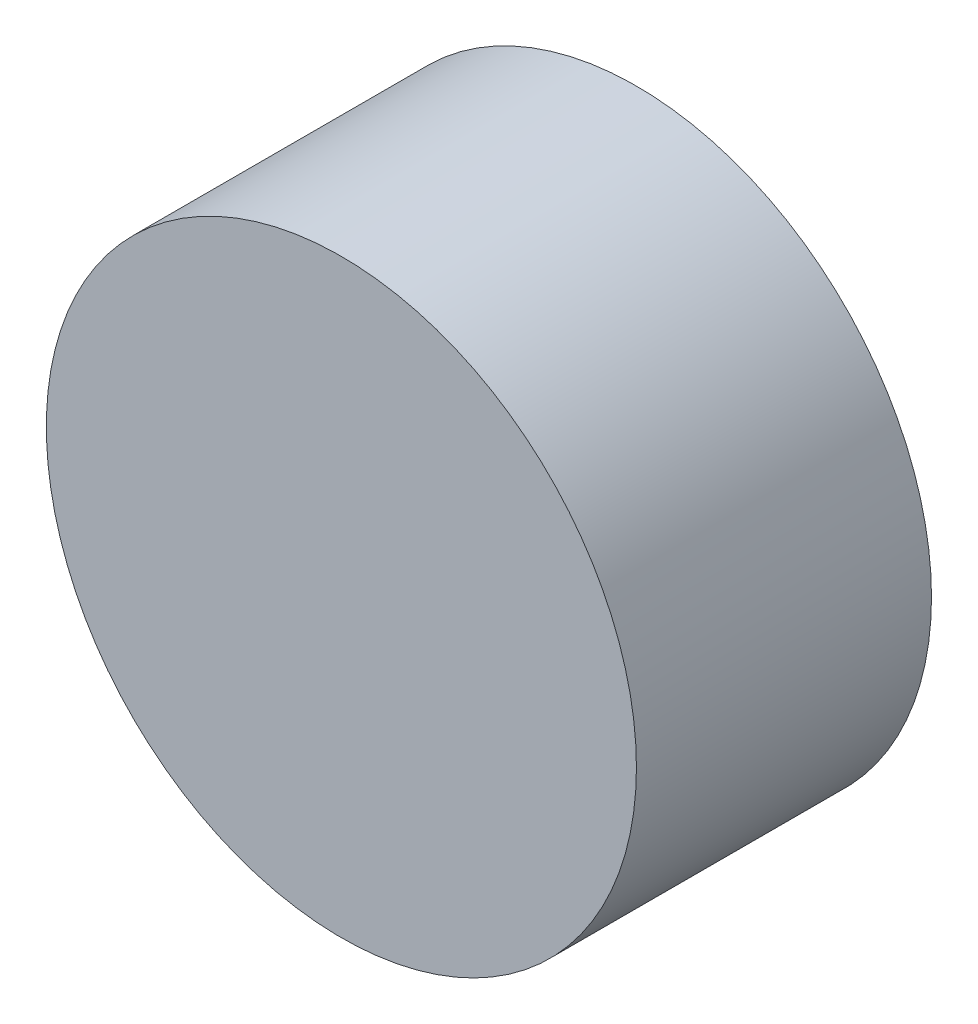
ISO-10303-21;
HEADER;
FILE_DESCRIPTION(('STEP AP214'),'2;1');
FILE_NAME('part.step','',(''),(''),'','','');
FILE_SCHEMA(('AUTOMOTIVE_DESIGN { 1 0 10303 214 1 1 1 1 }'));
ENDSEC;
DATA;
#1=APPLICATION_CONTEXT('core data for automotive mechanical design processes');
#2=APPLICATION_PROTOCOL_DEFINITION('international standard','automotive_design',2000,#1);
#3=PRODUCT_CONTEXT('',#1,'mechanical');
#4=PRODUCT('Part','Part','',(#3));
#5=PRODUCT_RELATED_PRODUCT_CATEGORY('part','',(#4));
#6=PRODUCT_DEFINITION_FORMATION('','',#4);
#7=PRODUCT_DEFINITION_CONTEXT('part definition',#1,'design');
#8=PRODUCT_DEFINITION('design','',#6,#7);
#9=PRODUCT_DEFINITION_SHAPE('','',#8);
#10=(LENGTH_UNIT() NAMED_UNIT(*) SI_UNIT(.MILLI.,.METRE.));
#11=(NAMED_UNIT(*) PLANE_ANGLE_UNIT() SI_UNIT($,.RADIAN.));
#12=(NAMED_UNIT(*) SI_UNIT($,.STERADIAN.) SOLID_ANGLE_UNIT());
#13=UNCERTAINTY_MEASURE_WITH_UNIT(LENGTH_MEASURE(1.E-05),#10,'distance_accuracy_value','');
#14=(GEOMETRIC_REPRESENTATION_CONTEXT(3) GLOBAL_UNCERTAINTY_ASSIGNED_CONTEXT((#13)) GLOBAL_UNIT_ASSIGNED_CONTEXT((#10,
#11,#12)) REPRESENTATION_CONTEXT('',''));
#15=CARTESIAN_POINT('',(0.,0.,0.));
#16=DIRECTION('',(0.,0.,1.));
#17=DIRECTION('',(1.,0.,0.));
#18=AXIS2_PLACEMENT_3D('',#15,#16,#17);
#19=CARTESIAN_POINT('',(0.,0.,100.));
#20=DIRECTION('',(0.,0.,-1.));
#21=DIRECTION('',(-1.,0.,0.));
#22=AXIS2_PLACEMENT_3D('',#19,#20,#21);
#23=CYLINDRICAL_SURFACE('',#22,100.);
#24=CARTESIAN_POINT('',(0.,0.,100.));
#25=DIRECTION('',(0.,0.,1.));
#26=DIRECTION('',(1.,0.,0.));
#27=AXIS2_PLACEMENT_3D('',#24,#25,#26);
#28=CIRCLE('',#27,100.);
#29=CARTESIAN_POINT('',(100.,0.,100.));
#30=VERTEX_POINT('',#29);
#31=EDGE_CURVE('E10',#30,#30,#28,.T.);
#32=ORIENTED_EDGE('',*,*,#31,.F.);
#33=EDGE_LOOP('',(#32));
#34=FACE_BOUND('',#33,.T.);
#35=CARTESIAN_POINT('',(0.,0.,0.));
#36=DIRECTION('',(0.,0.,1.));
#37=DIRECTION('',(1.,0.,0.));
#38=AXIS2_PLACEMENT_3D('',#35,#36,#37);
#39=CIRCLE('',#38,100.);
#40=CARTESIAN_POINT('',(100.,0.,0.));
#41=VERTEX_POINT('',#40);
#42=EDGE_CURVE('E37',#41,#41,#39,.T.);
#43=ORIENTED_EDGE('',*,*,#42,.T.);
#44=EDGE_LOOP('',(#43));
#45=FACE_BOUND('',#44,.T.);
#46=ADVANCED_FACE('F34',(#34,#45),#23,.T.);
#47=CARTESIAN_POINT('',(0.,0.,100.));
#48=DIRECTION('',(0.,0.,1.));
#49=DIRECTION('',(1.,0.,0.));
#50=AXIS2_PLACEMENT_3D('',#47,#48,#49);
#51=PLANE('',#50);
#52=ORIENTED_EDGE('',*,*,#31,.T.);
#53=EDGE_LOOP('',(#52));
#54=FACE_BOUND('',#53,.T.);
#55=ADVANCED_FACE('F63',(#54),#51,.T.);
#56=CARTESIAN_POINT('',(0.,0.,0.));
#57=DIRECTION('',(0.,0.,1.));
#58=DIRECTION('',(1.,0.,0.));
#59=AXIS2_PLACEMENT_3D('',#56,#57,#58);
#60=PLANE('',#59);
#61=CARTESIAN_POINT('',(0.,0.,0.));
#62=DIRECTION('',(0.,0.,-1.));
#63=DIRECTION('',(-1.,0.,0.));
#64=AXIS2_PLACEMENT_3D('',#61,#62,#63);
#65=CIRCLE('',#64,15.);
#66=CARTESIAN_POINT('',(-15.,0.,0.));
#67=VERTEX_POINT('',#66);
#68=EDGE_CURVE('E46',#67,#67,#65,.T.);
#69=ORIENTED_EDGE('',*,*,#68,.F.);
#70=EDGE_LOOP('',(#69));
#71=FACE_BOUND('',#70,.T.);
#72=ORIENTED_EDGE('',*,*,#42,.F.);
#73=EDGE_LOOP('',(#72));
#74=FACE_BOUND('',#73,.T.);
#75=ADVANCED_FACE('F57',(#71,#74),#60,.F.);
#76=CARTESIAN_POINT('',(0.,0.,10.));
#77=DIRECTION('',(0.,0.,-1.));
#78=DIRECTION('',(-1.,0.,0.));
#79=AXIS2_PLACEMENT_3D('',#76,#77,#78);
#80=CYLINDRICAL_SURFACE('',#79,15.);
#81=CARTESIAN_POINT('',(0.,0.,10.));
#82=DIRECTION('',(0.,0.,-1.));
#83=DIRECTION('',(-1.,0.,0.));
#84=AXIS2_PLACEMENT_3D('',#81,#82,#83);
#85=CIRCLE('',#84,15.);
#86=CARTESIAN_POINT('',(-15.,0.,10.));
#87=VERTEX_POINT('',#86);
#88=EDGE_CURVE('E44',#87,#87,#85,.T.);
#89=ORIENTED_EDGE('',*,*,#88,.F.);
#90=EDGE_LOOP('',(#89));
#91=FACE_BOUND('',#90,.T.);
#92=ORIENTED_EDGE('',*,*,#68,.T.);
#93=EDGE_LOOP('',(#92));
#94=FACE_BOUND('',#93,.T.);
#95=ADVANCED_FACE('F54',(#91,#94),#80,.F.);
#96=CARTESIAN_POINT('',(0.,0.,10.));
#97=DIRECTION('',(0.,0.,-1.));
#98=DIRECTION('',(-1.,0.,0.));
#99=AXIS2_PLACEMENT_3D('',#96,#97,#98);
#100=PLANE('',#99);
#101=ORIENTED_EDGE('',*,*,#88,.T.);
#102=EDGE_LOOP('',(#101));
#103=FACE_BOUND('',#102,.T.);
#104=ADVANCED_FACE('F52',(#103),#100,.T.);
#105=CLOSED_SHELL('',(#46,#55,#75,#95,#104));
#106=MANIFOLD_SOLID_BREP('B2',#105);
#107=ADVANCED_BREP_SHAPE_REPRESENTATION('',(#18,#106),#14);
#108=SHAPE_DEFINITION_REPRESENTATION(#9,#107);
ENDSEC;
END-ISO-10303-21;
